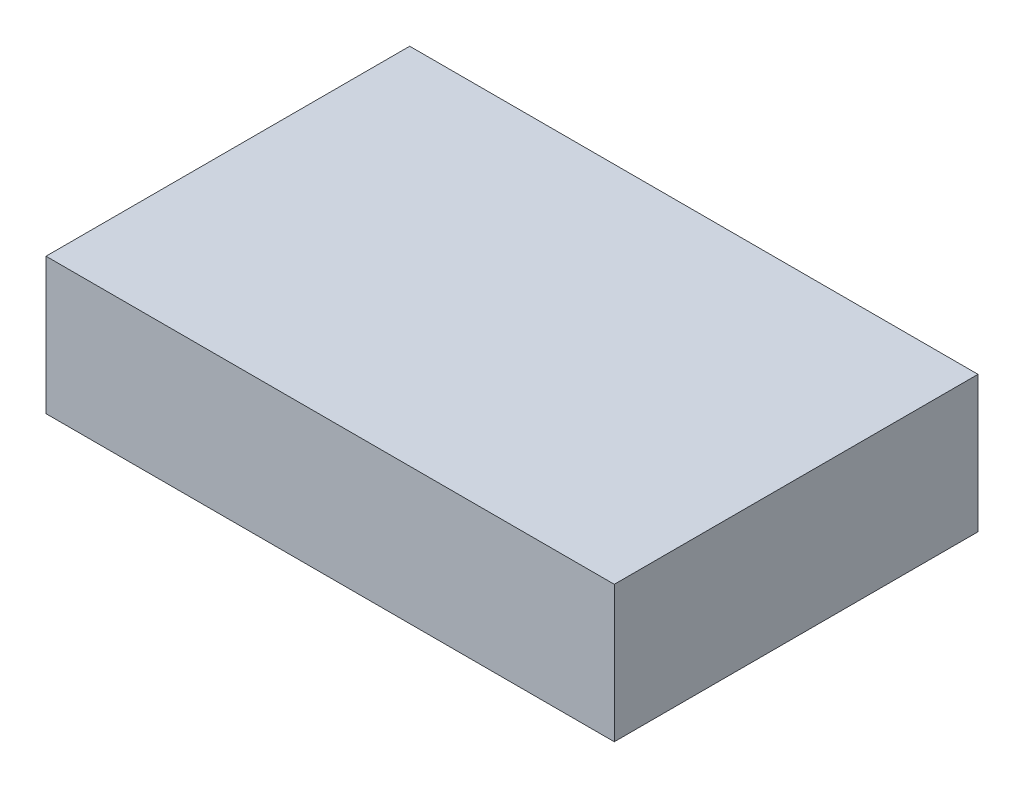
ISO-10303-21;
HEADER;
FILE_DESCRIPTION(('STEP AP214'),'2;1');
FILE_NAME('part.step','',(''),(''),'','','');
FILE_SCHEMA(('AUTOMOTIVE_DESIGN { 1 0 10303 214 1 1 1 1 }'));
ENDSEC;
DATA;
#1=APPLICATION_CONTEXT('core data for automotive mechanical design processes');
#2=APPLICATION_PROTOCOL_DEFINITION('international standard','automotive_design',2000,#1);
#3=PRODUCT_CONTEXT('',#1,'mechanical');
#4=PRODUCT('Part','Part','',(#3));
#5=PRODUCT_RELATED_PRODUCT_CATEGORY('part','',(#4));
#6=PRODUCT_DEFINITION_FORMATION('','',#4);
#7=PRODUCT_DEFINITION_CONTEXT('part definition',#1,'design');
#8=PRODUCT_DEFINITION('design','',#6,#7);
#9=PRODUCT_DEFINITION_SHAPE('','',#8);
#10=(LENGTH_UNIT() NAMED_UNIT(*) SI_UNIT(.MILLI.,.METRE.));
#11=(NAMED_UNIT(*) PLANE_ANGLE_UNIT() SI_UNIT($,.RADIAN.));
#12=(NAMED_UNIT(*) SI_UNIT($,.STERADIAN.) SOLID_ANGLE_UNIT());
#13=UNCERTAINTY_MEASURE_WITH_UNIT(LENGTH_MEASURE(1.E-05),#10,'distance_accuracy_value','');
#14=(GEOMETRIC_REPRESENTATION_CONTEXT(3) GLOBAL_UNCERTAINTY_ASSIGNED_CONTEXT((#13)) GLOBAL_UNIT_ASSIGNED_CONTEXT((#10,
#11,#12)) REPRESENTATION_CONTEXT('',''));
#15=CARTESIAN_POINT('',(0.,0.,0.));
#16=DIRECTION('',(0.,0.,1.));
#17=DIRECTION('',(1.,0.,0.));
#18=AXIS2_PLACEMENT_3D('',#15,#16,#17);
#19=CARTESIAN_POINT('',(125.,60.,80.));
#20=DIRECTION('',(-1.,0.,0.));
#21=DIRECTION('',(0.,0.,1.));
#22=AXIS2_PLACEMENT_3D('',#19,#20,#21);
#23=PLANE('',#22);
#24=DIRECTION('',(0.,0.,-1.));
#25=VECTOR('',#24,1.);
#26=CARTESIAN_POINT('',(125.,0.,80.));
#27=LINE('',#26,#25);
#28=CARTESIAN_POINT('',(125.,0.,80.));
#29=VERTEX_POINT('',#28);
#30=CARTESIAN_POINT('',(125.,0.,-80.));
#31=VERTEX_POINT('',#30);
#32=EDGE_CURVE('E107',#29,#31,#27,.T.);
#33=ORIENTED_EDGE('',*,*,#32,.T.);
#34=DIRECTION('',(0.,-1.,0.));
#35=VECTOR('',#34,1.);
#36=CARTESIAN_POINT('',(125.,60.,-80.));
#37=LINE('',#36,#35);
#38=CARTESIAN_POINT('',(125.,60.,-80.));
#39=VERTEX_POINT('',#38);
#40=EDGE_CURVE('E11',#39,#31,#37,.T.);
#41=ORIENTED_EDGE('',*,*,#40,.F.);
#42=DIRECTION('',(0.,0.,-1.));
#43=VECTOR('',#42,1.);
#44=CARTESIAN_POINT('',(125.,60.,80.));
#45=LINE('',#44,#43);
#46=CARTESIAN_POINT('',(125.,60.,80.));
#47=VERTEX_POINT('',#46);
#48=EDGE_CURVE('E91',#47,#39,#45,.T.);
#49=ORIENTED_EDGE('',*,*,#48,.F.);
#50=DIRECTION('',(0.,-1.,0.));
#51=VECTOR('',#50,1.);
#52=CARTESIAN_POINT('',(125.,60.,80.));
#53=LINE('',#52,#51);
#54=EDGE_CURVE('E103',#47,#29,#53,.T.);
#55=ORIENTED_EDGE('',*,*,#54,.T.);
#56=EDGE_LOOP('',(#33,#41,#49,#55));
#57=FACE_BOUND('',#56,.T.);
#58=ADVANCED_FACE('F39',(#57),#23,.F.);
#59=CARTESIAN_POINT('',(-125.,60.,-80.));
#60=DIRECTION('',(0.,0.,1.));
#61=DIRECTION('',(1.,0.,0.));
#62=AXIS2_PLACEMENT_3D('',#59,#60,#61);
#63=PLANE('',#62);
#64=DIRECTION('',(-1.,0.,0.));
#65=VECTOR('',#64,1.);
#66=CARTESIAN_POINT('',(-125.,0.,-80.));
#67=LINE('',#66,#65);
#68=CARTESIAN_POINT('',(-125.,0.,-80.));
#69=VERTEX_POINT('',#68);
#70=EDGE_CURVE('E96',#31,#69,#67,.T.);
#71=ORIENTED_EDGE('',*,*,#70,.T.);
#72=DIRECTION('',(0.,-1.,0.));
#73=VECTOR('',#72,1.);
#74=CARTESIAN_POINT('',(-125.,60.,-80.));
#75=LINE('',#74,#73);
#76=CARTESIAN_POINT('',(-125.,60.,-80.));
#77=VERTEX_POINT('',#76);
#78=EDGE_CURVE('E48',#77,#69,#75,.T.);
#79=ORIENTED_EDGE('',*,*,#78,.F.);
#80=DIRECTION('',(-1.,0.,0.));
#81=VECTOR('',#80,1.);
#82=CARTESIAN_POINT('',(-125.,60.,-80.));
#83=LINE('',#82,#81);
#84=EDGE_CURVE('E86',#39,#77,#83,.T.);
#85=ORIENTED_EDGE('',*,*,#84,.F.);
#86=ORIENTED_EDGE('',*,*,#40,.T.);
#87=EDGE_LOOP('',(#71,#79,#85,#86));
#88=FACE_BOUND('',#87,.T.);
#89=ADVANCED_FACE('F95',(#88),#63,.F.);
#90=CARTESIAN_POINT('',(-125.,60.,80.));
#91=DIRECTION('',(1.,0.,0.));
#92=DIRECTION('',(0.,0.,-1.));
#93=AXIS2_PLACEMENT_3D('',#90,#91,#92);
#94=PLANE('',#93);
#95=DIRECTION('',(0.,0.,1.));
#96=VECTOR('',#95,1.);
#97=CARTESIAN_POINT('',(-125.,0.,80.));
#98=LINE('',#97,#96);
#99=CARTESIAN_POINT('',(-125.,0.,80.));
#100=VERTEX_POINT('',#99);
#101=EDGE_CURVE('E73',#69,#100,#98,.T.);
#102=ORIENTED_EDGE('',*,*,#101,.T.);
#103=DIRECTION('',(0.,-1.,0.));
#104=VECTOR('',#103,1.);
#105=CARTESIAN_POINT('',(-125.,60.,80.));
#106=LINE('',#105,#104);
#107=CARTESIAN_POINT('',(-125.,60.,80.));
#108=VERTEX_POINT('',#107);
#109=EDGE_CURVE('E98',#108,#100,#106,.T.);
#110=ORIENTED_EDGE('',*,*,#109,.F.);
#111=DIRECTION('',(0.,0.,1.));
#112=VECTOR('',#111,1.);
#113=CARTESIAN_POINT('',(-125.,60.,80.));
#114=LINE('',#113,#112);
#115=EDGE_CURVE('E89',#77,#108,#114,.T.);
#116=ORIENTED_EDGE('',*,*,#115,.F.);
#117=ORIENTED_EDGE('',*,*,#78,.T.);
#118=EDGE_LOOP('',(#102,#110,#116,#117));
#119=FACE_BOUND('',#118,.T.);
#120=ADVANCED_FACE('F99',(#119),#94,.F.);
#121=CARTESIAN_POINT('',(-125.,60.,80.));
#122=DIRECTION('',(0.,0.,-1.));
#123=DIRECTION('',(-1.,0.,0.));
#124=AXIS2_PLACEMENT_3D('',#121,#122,#123);
#125=PLANE('',#124);
#126=DIRECTION('',(1.,0.,0.));
#127=VECTOR('',#126,1.);
#128=CARTESIAN_POINT('',(-125.,0.,80.));
#129=LINE('',#128,#127);
#130=EDGE_CURVE('E79',#100,#29,#129,.T.);
#131=ORIENTED_EDGE('',*,*,#130,.T.);
#132=ORIENTED_EDGE('',*,*,#54,.F.);
#133=DIRECTION('',(1.,0.,0.));
#134=VECTOR('',#133,1.);
#135=CARTESIAN_POINT('',(-125.,60.,80.));
#136=LINE('',#135,#134);
#137=EDGE_CURVE('E56',#108,#47,#136,.T.);
#138=ORIENTED_EDGE('',*,*,#137,.F.);
#139=ORIENTED_EDGE('',*,*,#109,.T.);
#140=EDGE_LOOP('',(#131,#132,#138,#139));
#141=FACE_BOUND('',#140,.T.);
#142=ADVANCED_FACE('F120',(#141),#125,.F.);
#143=CARTESIAN_POINT('',(0.,60.,0.));
#144=DIRECTION('',(0.,-1.,0.));
#145=DIRECTION('',(0.,0.,-1.));
#146=AXIS2_PLACEMENT_3D('',#143,#144,#145);
#147=PLANE('',#146);
#148=ORIENTED_EDGE('',*,*,#48,.T.);
#149=ORIENTED_EDGE('',*,*,#84,.T.);
#150=ORIENTED_EDGE('',*,*,#115,.T.);
#151=ORIENTED_EDGE('',*,*,#137,.T.);
#152=EDGE_LOOP('',(#148,#149,#150,#151));
#153=FACE_BOUND('',#152,.T.);
#154=ADVANCED_FACE('F87',(#153),#147,.F.);
#155=CARTESIAN_POINT('',(0.,0.,0.));
#156=DIRECTION('',(0.,-1.,0.));
#157=DIRECTION('',(0.,0.,-1.));
#158=AXIS2_PLACEMENT_3D('',#155,#156,#157);
#159=PLANE('',#158);
#160=ORIENTED_EDGE('',*,*,#32,.F.);
#161=ORIENTED_EDGE('',*,*,#130,.F.);
#162=ORIENTED_EDGE('',*,*,#101,.F.);
#163=ORIENTED_EDGE('',*,*,#70,.F.);
#164=EDGE_LOOP('',(#160,#161,#162,#163));
#165=FACE_BOUND('',#164,.T.);
#166=ADVANCED_FACE('F123',(#165),#159,.T.);
#167=CLOSED_SHELL('',(#58,#89,#120,#142,#154,#166));
#168=MANIFOLD_SOLID_BREP('B2',#167);
#169=ADVANCED_BREP_SHAPE_REPRESENTATION('',(#18,#168),#14);
#170=SHAPE_DEFINITION_REPRESENTATION(#9,#169);
ENDSEC;
END-ISO-10303-21;
